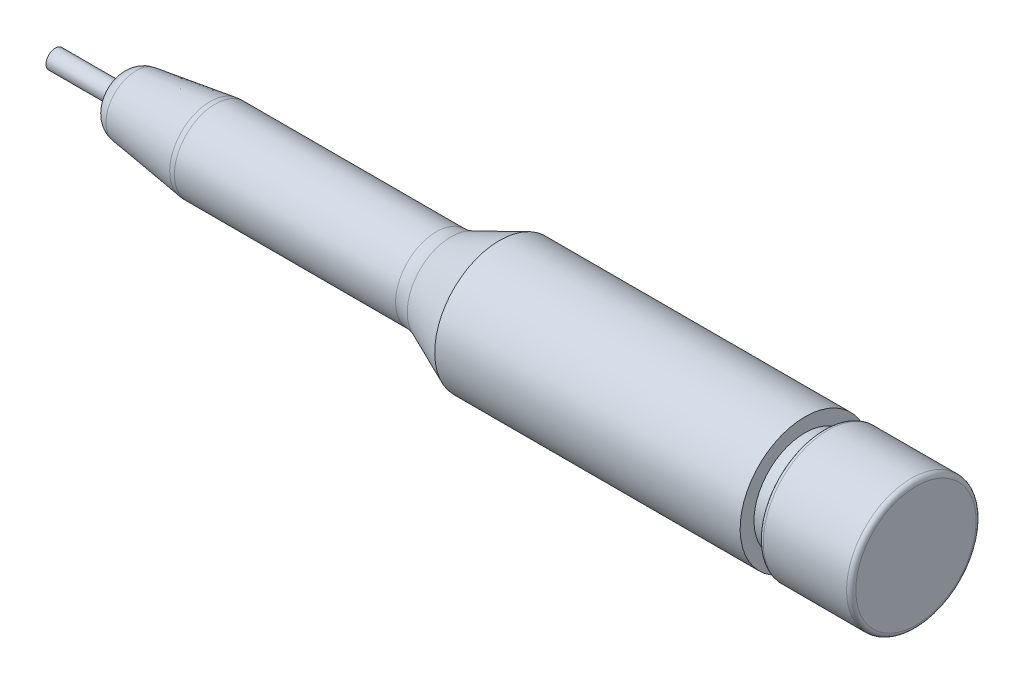
ISO-10303-21;
HEADER;
FILE_DESCRIPTION(('STEP AP214'),'2;1');
FILE_NAME('part.step','',(''),(''),'','','');
FILE_SCHEMA(('AUTOMOTIVE_DESIGN { 1 0 10303 214 1 1 1 1 }'));
ENDSEC;
DATA;
#1=APPLICATION_CONTEXT('core data for automotive mechanical design processes');
#2=APPLICATION_PROTOCOL_DEFINITION('international standard','automotive_design',2000,#1);
#3=PRODUCT_CONTEXT('',#1,'mechanical');
#4=PRODUCT('Part','Part','',(#3));
#5=PRODUCT_RELATED_PRODUCT_CATEGORY('part','',(#4));
#6=PRODUCT_DEFINITION_FORMATION('','',#4);
#7=PRODUCT_DEFINITION_CONTEXT('part definition',#1,'design');
#8=PRODUCT_DEFINITION('design','',#6,#7);
#9=PRODUCT_DEFINITION_SHAPE('','',#8);
#10=(LENGTH_UNIT() NAMED_UNIT(*) SI_UNIT(.MILLI.,.METRE.));
#11=(NAMED_UNIT(*) PLANE_ANGLE_UNIT() SI_UNIT($,.RADIAN.));
#12=(NAMED_UNIT(*) SI_UNIT($,.STERADIAN.) SOLID_ANGLE_UNIT());
#13=UNCERTAINTY_MEASURE_WITH_UNIT(LENGTH_MEASURE(1.E-05),#10,'distance_accuracy_value','');
#14=(GEOMETRIC_REPRESENTATION_CONTEXT(3) GLOBAL_UNCERTAINTY_ASSIGNED_CONTEXT((#13)) GLOBAL_UNIT_ASSIGNED_CONTEXT((#10,
#11,#12)) REPRESENTATION_CONTEXT('',''));
#15=CARTESIAN_POINT('',(0.,0.,0.));
#16=DIRECTION('',(0.,0.,1.));
#17=DIRECTION('',(1.,0.,0.));
#18=AXIS2_PLACEMENT_3D('',#15,#16,#17);
#19=CARTESIAN_POINT('',(0.,0.,0.));
#20=DIRECTION('',(-1.,0.,0.));
#21=DIRECTION('',(0.,-1.,0.));
#22=AXIS2_PLACEMENT_3D('',#19,#20,#21);
#23=PLANE('',#22);
#24=CARTESIAN_POINT('',(0.,0.,0.));
#25=DIRECTION('',(1.,0.,0.));
#26=DIRECTION('',(0.,1.,0.));
#27=AXIS2_PLACEMENT_3D('',#24,#25,#26);
#28=CIRCLE('',#27,0.999999999999989);
#29=CARTESIAN_POINT('',(0.,0.999999999999989,0.));
#30=VERTEX_POINT('',#29);
#31=EDGE_CURVE('E76',#30,#30,#28,.T.);
#32=ORIENTED_EDGE('',*,*,#31,.F.);
#33=EDGE_LOOP('',(#32));
#34=FACE_BOUND('',#33,.T.);
#35=ADVANCED_FACE('F38',(#34),#23,.T.);
#36=CARTESIAN_POINT('',(93.,0.,0.));
#37=DIRECTION('',(1.,0.,0.));
#38=DIRECTION('',(0.,1.,0.));
#39=AXIS2_PLACEMENT_3D('',#36,#37,#38);
#40=CYLINDRICAL_SURFACE('',#39,0.99999999999999);
#41=ORIENTED_EDGE('',*,*,#31,.T.);
#42=EDGE_LOOP('',(#41));
#43=FACE_BOUND('',#42,.T.);
#44=CARTESIAN_POINT('',(7.00000000000001,0.,0.));
#45=DIRECTION('',(1.,0.,0.));
#46=DIRECTION('',(0.,1.,0.));
#47=AXIS2_PLACEMENT_3D('',#44,#45,#46);
#48=CIRCLE('',#47,0.99999999999999);
#49=CARTESIAN_POINT('',(7.00000000000001,0.99999999999999,0.));
#50=VERTEX_POINT('',#49);
#51=EDGE_CURVE('E79',#50,#50,#48,.T.);
#52=ORIENTED_EDGE('',*,*,#51,.F.);
#53=EDGE_LOOP('',(#52));
#54=FACE_BOUND('',#53,.T.);
#55=ADVANCED_FACE('F112',(#43,#54),#40,.T.);
#56=CARTESIAN_POINT('',(7.,0.99999999999999,0.));
#57=DIRECTION('',(-1.,0.,0.));
#58=DIRECTION('',(0.,-1.,0.));
#59=AXIS2_PLACEMENT_3D('',#56,#57,#58);
#60=PLANE('',#59);
#61=CARTESIAN_POINT('',(7.,0.,0.));
#62=DIRECTION('',(-1.,0.,0.));
#63=DIRECTION('',(0.,-1.,0.));
#64=AXIS2_PLACEMENT_3D('',#61,#62,#63);
#65=CIRCLE('',#64,1.26049511018169);
#66=CARTESIAN_POINT('',(7.,-1.26049511018169,0.));
#67=VERTEX_POINT('',#66);
#68=EDGE_CURVE('E70',#67,#67,#65,.T.);
#69=ORIENTED_EDGE('',*,*,#68,.T.);
#70=EDGE_LOOP('',(#69));
#71=FACE_BOUND('',#70,.T.);
#72=ORIENTED_EDGE('',*,*,#51,.T.);
#73=EDGE_LOOP('',(#72));
#74=FACE_BOUND('',#73,.T.);
#75=ADVANCED_FACE('F118',(#71,#74),#60,.T.);
#76=CARTESIAN_POINT('',(17.,0.,0.));
#77=DIRECTION('',(1.,0.,0.));
#78=DIRECTION('',(0.,1.,0.));
#79=AXIS2_PLACEMENT_3D('',#76,#77,#78);
#80=CONICAL_SURFACE('',#79,4.39999999999999,0.139095941482071);
#81=CARTESIAN_POINT('',(16.7240499049809,0.,0.));
#82=DIRECTION('',(-1.,0.,0.));
#83=DIRECTION('',(0.,-1.,0.));
#84=AXIS2_PLACEMENT_3D('',#81,#82,#83);
#85=CIRCLE('',#84,4.36136698669732);
#86=CARTESIAN_POINT('',(16.7240499049809,-4.36136698669732,0.));
#87=VERTEX_POINT('',#86);
#88=EDGE_CURVE('E58',#87,#87,#85,.T.);
#89=ORIENTED_EDGE('',*,*,#88,.T.);
#90=EDGE_LOOP('',(#89));
#91=FACE_BOUND('',#90,.T.);
#92=CARTESIAN_POINT('',(8.72270431093119,0.,0.));
#93=DIRECTION('',(-1.,0.,0.));
#94=DIRECTION('',(0.,-1.,0.));
#95=AXIS2_PLACEMENT_3D('',#92,#93,#94);
#96=CIRCLE('',#95,3.24117860353036);
#97=CARTESIAN_POINT('',(8.72270431093119,-3.24117860353036,0.));
#98=VERTEX_POINT('',#97);
#99=EDGE_CURVE('E73',#98,#98,#96,.F.);
#100=ORIENTED_EDGE('',*,*,#99,.T.);
#101=EDGE_LOOP('',(#100));
#102=FACE_BOUND('',#101,.T.);
#103=ADVANCED_FACE('F206',(#91,#102),#80,.T.);
#104=CARTESIAN_POINT('',(93.,0.,0.));
#105=DIRECTION('',(1.,0.,0.));
#106=DIRECTION('',(0.,1.,0.));
#107=AXIS2_PLACEMENT_3D('',#104,#105,#106);
#108=CYLINDRICAL_SURFACE('',#107,4.39999999999999);
#109=CARTESIAN_POINT('',(41.170595246602,0.,0.));
#110=DIRECTION('',(1.,0.,0.));
#111=DIRECTION('',(0.,1.,0.));
#112=AXIS2_PLACEMENT_3D('',#109,#110,#111);
#113=CIRCLE('',#112,4.39999999999999);
#114=CARTESIAN_POINT('',(41.170595246602,4.39999999999999,0.));
#115=VERTEX_POINT('',#114);
#116=EDGE_CURVE('E61',#115,#115,#113,.F.);
#117=ORIENTED_EDGE('',*,*,#116,.T.);
#118=EDGE_LOOP('',(#117));
#119=FACE_BOUND('',#118,.T.);
#120=CARTESIAN_POINT('',(17.2786412831185,0.,0.));
#121=DIRECTION('',(-1.,0.,0.));
#122=DIRECTION('',(0.,-1.,0.));
#123=AXIS2_PLACEMENT_3D('',#120,#121,#122);
#124=CIRCLE('',#123,4.39999999999999);
#125=CARTESIAN_POINT('',(17.2786412831185,-4.39999999999999,0.));
#126=VERTEX_POINT('',#125);
#127=EDGE_CURVE('E64',#126,#126,#124,.F.);
#128=ORIENTED_EDGE('',*,*,#127,.T.);
#129=EDGE_LOOP('',(#128));
#130=FACE_BOUND('',#129,.T.);
#131=ADVANCED_FACE('F211',(#119,#130),#108,.T.);
#132=CARTESIAN_POINT('',(48.,0.,0.));
#133=DIRECTION('',(1.,0.,0.));
#134=DIRECTION('',(0.,1.,0.));
#135=AXIS2_PLACEMENT_3D('',#132,#133,#134);
#136=CONICAL_SURFACE('',#135,6.99999999999999,0.408907828950925);
#137=CARTESIAN_POINT('',(42.7610249971392,0.,0.));
#138=DIRECTION('',(1.,0.,0.));
#139=DIRECTION('',(0.,1.,0.));
#140=AXIS2_PLACEMENT_3D('',#137,#138,#139);
#141=CIRCLE('',#140,4.7297774987603);
#142=CARTESIAN_POINT('',(42.7610249971392,4.7297774987603,0.));
#143=VERTEX_POINT('',#142);
#144=EDGE_CURVE('E67',#143,#143,#141,.T.);
#145=ORIENTED_EDGE('',*,*,#144,.T.);
#146=EDGE_LOOP('',(#145));
#147=FACE_BOUND('',#146,.T.);
#148=CARTESIAN_POINT('',(48.,0.,0.));
#149=DIRECTION('',(1.,0.,0.));
#150=DIRECTION('',(0.,1.,0.));
#151=AXIS2_PLACEMENT_3D('',#148,#149,#150);
#152=CIRCLE('',#151,6.99999999999999);
#153=CARTESIAN_POINT('',(48.,6.99999999999999,0.));
#154=VERTEX_POINT('',#153);
#155=EDGE_CURVE('E82',#154,#154,#152,.T.);
#156=ORIENTED_EDGE('',*,*,#155,.F.);
#157=EDGE_LOOP('',(#156));
#158=FACE_BOUND('',#157,.T.);
#159=ADVANCED_FACE('F220',(#147,#158),#136,.T.);
#160=CARTESIAN_POINT('',(93.,0.,0.));
#161=DIRECTION('',(1.,0.,0.));
#162=DIRECTION('',(0.,1.,0.));
#163=AXIS2_PLACEMENT_3D('',#160,#161,#162);
#164=CYLINDRICAL_SURFACE('',#163,6.99999999999999);
#165=ORIENTED_EDGE('',*,*,#155,.T.);
#166=EDGE_LOOP('',(#165));
#167=FACE_BOUND('',#166,.T.);
#168=CARTESIAN_POINT('',(81.,0.,0.));
#169=DIRECTION('',(1.,0.,0.));
#170=DIRECTION('',(0.,1.,0.));
#171=AXIS2_PLACEMENT_3D('',#168,#169,#170);
#172=CIRCLE('',#171,6.99999999999999);
#173=CARTESIAN_POINT('',(81.,6.99999999999999,0.));
#174=VERTEX_POINT('',#173);
#175=EDGE_CURVE('E85',#174,#174,#172,.T.);
#176=ORIENTED_EDGE('',*,*,#175,.F.);
#177=EDGE_LOOP('',(#176));
#178=FACE_BOUND('',#177,.T.);
#179=ADVANCED_FACE('F108',(#167,#178),#164,.T.);
#180=CARTESIAN_POINT('',(81.,6.99999999999999,0.));
#181=DIRECTION('',(1.,0.,0.));
#182=DIRECTION('',(0.,1.,0.));
#183=AXIS2_PLACEMENT_3D('',#180,#181,#182);
#184=PLANE('',#183);
#185=ORIENTED_EDGE('',*,*,#175,.T.);
#186=EDGE_LOOP('',(#185));
#187=FACE_BOUND('',#186,.T.);
#188=CARTESIAN_POINT('',(81.,0.,0.));
#189=DIRECTION('',(1.,0.,0.));
#190=DIRECTION('',(0.,1.,0.));
#191=AXIS2_PLACEMENT_3D('',#188,#189,#190);
#192=CIRCLE('',#191,5.5);
#193=CARTESIAN_POINT('',(81.,5.5,0.));
#194=VERTEX_POINT('',#193);
#195=EDGE_CURVE('E88',#194,#194,#192,.T.);
#196=ORIENTED_EDGE('',*,*,#195,.F.);
#197=EDGE_LOOP('',(#196));
#198=FACE_BOUND('',#197,.T.);
#199=ADVANCED_FACE('F99',(#187,#198),#184,.T.);
#200=CARTESIAN_POINT('',(93.,0.,0.));
#201=DIRECTION('',(1.,0.,0.));
#202=DIRECTION('',(0.,1.,0.));
#203=AXIS2_PLACEMENT_3D('',#200,#201,#202);
#204=CYLINDRICAL_SURFACE('',#203,5.5);
#205=ORIENTED_EDGE('',*,*,#195,.T.);
#206=EDGE_LOOP('',(#205));
#207=FACE_BOUND('',#206,.T.);
#208=CARTESIAN_POINT('',(83.,0.,0.));
#209=DIRECTION('',(1.,0.,0.));
#210=DIRECTION('',(0.,1.,0.));
#211=AXIS2_PLACEMENT_3D('',#208,#209,#210);
#212=CIRCLE('',#211,5.5);
#213=CARTESIAN_POINT('',(83.,5.5,0.));
#214=VERTEX_POINT('',#213);
#215=EDGE_CURVE('E91',#214,#214,#212,.T.);
#216=ORIENTED_EDGE('',*,*,#215,.F.);
#217=EDGE_LOOP('',(#216));
#218=FACE_BOUND('',#217,.T.);
#219=ADVANCED_FACE('F97',(#207,#218),#204,.T.);
#220=CARTESIAN_POINT('',(83.,5.5,0.));
#221=DIRECTION('',(-1.,0.,0.));
#222=DIRECTION('',(0.,-1.,0.));
#223=AXIS2_PLACEMENT_3D('',#220,#221,#222);
#224=PLANE('',#223);
#225=CARTESIAN_POINT('',(83.,0.,0.));
#226=DIRECTION('',(-1.,0.,0.));
#227=DIRECTION('',(0.,-1.,0.));
#228=AXIS2_PLACEMENT_3D('',#225,#226,#227);
#229=CIRCLE('',#228,6.5);
#230=CARTESIAN_POINT('',(83.,-6.5,0.));
#231=VERTEX_POINT('',#230);
#232=EDGE_CURVE('E10',#231,#231,#229,.T.);
#233=ORIENTED_EDGE('',*,*,#232,.T.);
#234=EDGE_LOOP('',(#233));
#235=FACE_BOUND('',#234,.T.);
#236=ORIENTED_EDGE('',*,*,#215,.T.);
#237=EDGE_LOOP('',(#236));
#238=FACE_BOUND('',#237,.T.);
#239=ADVANCED_FACE('F95',(#235,#238),#224,.T.);
#240=CARTESIAN_POINT('',(93.,0.,0.));
#241=DIRECTION('',(1.,0.,0.));
#242=DIRECTION('',(0.,1.,0.));
#243=AXIS2_PLACEMENT_3D('',#240,#241,#242);
#244=CYLINDRICAL_SURFACE('',#243,7.);
#245=CARTESIAN_POINT('',(92.5,0.,0.));
#246=DIRECTION('',(1.,0.,0.));
#247=DIRECTION('',(0.,1.,0.));
#248=AXIS2_PLACEMENT_3D('',#245,#246,#247);
#249=CIRCLE('',#248,7.);
#250=CARTESIAN_POINT('',(92.5,7.,0.));
#251=VERTEX_POINT('',#250);
#252=EDGE_CURVE('E45',#251,#251,#249,.F.);
#253=ORIENTED_EDGE('',*,*,#252,.T.);
#254=EDGE_LOOP('',(#253));
#255=FACE_BOUND('',#254,.T.);
#256=CARTESIAN_POINT('',(83.5,0.,0.));
#257=DIRECTION('',(-1.,0.,0.));
#258=DIRECTION('',(0.,-1.,0.));
#259=AXIS2_PLACEMENT_3D('',#256,#257,#258);
#260=CIRCLE('',#259,7.);
#261=CARTESIAN_POINT('',(83.5,-7.,0.));
#262=VERTEX_POINT('',#261);
#263=EDGE_CURVE('E49',#262,#262,#260,.F.);
#264=ORIENTED_EDGE('',*,*,#263,.T.);
#265=EDGE_LOOP('',(#264));
#266=FACE_BOUND('',#265,.T.);
#267=ADVANCED_FACE('F106',(#255,#266),#244,.T.);
#268=CARTESIAN_POINT('',(93.,6.99999999999999,0.));
#269=DIRECTION('',(1.,0.,0.));
#270=DIRECTION('',(0.,1.,0.));
#271=AXIS2_PLACEMENT_3D('',#268,#269,#270);
#272=PLANE('',#271);
#273=CARTESIAN_POINT('',(93.,0.,0.));
#274=DIRECTION('',(1.,0.,0.));
#275=DIRECTION('',(0.,1.,0.));
#276=AXIS2_PLACEMENT_3D('',#273,#274,#275);
#277=CIRCLE('',#276,6.5);
#278=CARTESIAN_POINT('',(93.,6.5,0.));
#279=VERTEX_POINT('',#278);
#280=EDGE_CURVE('E53',#279,#279,#277,.T.);
#281=ORIENTED_EDGE('',*,*,#280,.T.);
#282=EDGE_LOOP('',(#281));
#283=FACE_BOUND('',#282,.T.);
#284=ADVANCED_FACE('F128',(#283),#272,.T.);
#285=CARTESIAN_POINT('',(9.,0.,0.));
#286=DIRECTION('',(-1.,0.,0.));
#287=DIRECTION('',(0.,-1.,0.));
#288=AXIS2_PLACEMENT_3D('',#285,#286,#287);
#289=DEGENERATE_TOROIDAL_SURFACE('',#288,1.26049511018169,2.,.T.);
#290=ORIENTED_EDGE('',*,*,#68,.F.);
#291=EDGE_LOOP('',(#290));
#292=FACE_BOUND('',#291,.T.);
#293=ORIENTED_EDGE('',*,*,#99,.F.);
#294=EDGE_LOOP('',(#293));
#295=FACE_BOUND('',#294,.T.);
#296=ADVANCED_FACE('F124',(#292,#295),#289,.T.);
#297=CARTESIAN_POINT('',(41.170595246602,0.,0.));
#298=DIRECTION('',(1.,0.,0.));
#299=DIRECTION('',(0.,1.,0.));
#300=AXIS2_PLACEMENT_3D('',#297,#298,#299);
#301=TOROIDAL_SURFACE('',#300,8.4,4.);
#302=ORIENTED_EDGE('',*,*,#116,.F.);
#303=EDGE_LOOP('',(#302));
#304=FACE_BOUND('',#303,.T.);
#305=ORIENTED_EDGE('',*,*,#144,.F.);
#306=EDGE_LOOP('',(#305));
#307=FACE_BOUND('',#306,.T.);
#308=ADVANCED_FACE('F127',(#304,#307),#301,.F.);
#309=CARTESIAN_POINT('',(17.2786412831185,0.,0.));
#310=DIRECTION('',(-1.,0.,0.));
#311=DIRECTION('',(0.,-1.,0.));
#312=AXIS2_PLACEMENT_3D('',#309,#310,#311);
#313=DEGENERATE_TOROIDAL_SURFACE('',#312,0.399999999999994,4.,.T.);
#314=ORIENTED_EDGE('',*,*,#88,.F.);
#315=EDGE_LOOP('',(#314));
#316=FACE_BOUND('',#315,.T.);
#317=ORIENTED_EDGE('',*,*,#127,.F.);
#318=EDGE_LOOP('',(#317));
#319=FACE_BOUND('',#318,.T.);
#320=ADVANCED_FACE('F132',(#316,#319),#313,.T.);
#321=CARTESIAN_POINT('',(92.5,0.,0.));
#322=DIRECTION('',(1.,0.,0.));
#323=DIRECTION('',(0.,1.,0.));
#324=AXIS2_PLACEMENT_3D('',#321,#322,#323);
#325=TOROIDAL_SURFACE('',#324,6.5,0.5);
#326=ORIENTED_EDGE('',*,*,#252,.F.);
#327=EDGE_LOOP('',(#326));
#328=FACE_BOUND('',#327,.T.);
#329=ORIENTED_EDGE('',*,*,#280,.F.);
#330=EDGE_LOOP('',(#329));
#331=FACE_BOUND('',#330,.T.);
#332=ADVANCED_FACE('F135',(#328,#331),#325,.T.);
#333=CARTESIAN_POINT('',(83.5,0.,0.));
#334=DIRECTION('',(-1.,0.,0.));
#335=DIRECTION('',(0.,-1.,0.));
#336=AXIS2_PLACEMENT_3D('',#333,#334,#335);
#337=TOROIDAL_SURFACE('',#336,6.5,0.5);
#338=ORIENTED_EDGE('',*,*,#232,.F.);
#339=EDGE_LOOP('',(#338));
#340=FACE_BOUND('',#339,.T.);
#341=ORIENTED_EDGE('',*,*,#263,.F.);
#342=EDGE_LOOP('',(#341));
#343=FACE_BOUND('',#342,.T.);
#344=ADVANCED_FACE('F40',(#340,#343),#337,.T.);
#345=CLOSED_SHELL('',(#35,#55,#75,#103,#131,#159,#179,#199,#219,#239,#267,#284,#296,#308,#320,
#332,#344));
#346=MANIFOLD_SOLID_BREP('B2',#345);
#347=ADVANCED_BREP_SHAPE_REPRESENTATION('',(#18,#346),#14);
#348=SHAPE_DEFINITION_REPRESENTATION(#9,#347);
ENDSEC;
END-ISO-10303-21;
